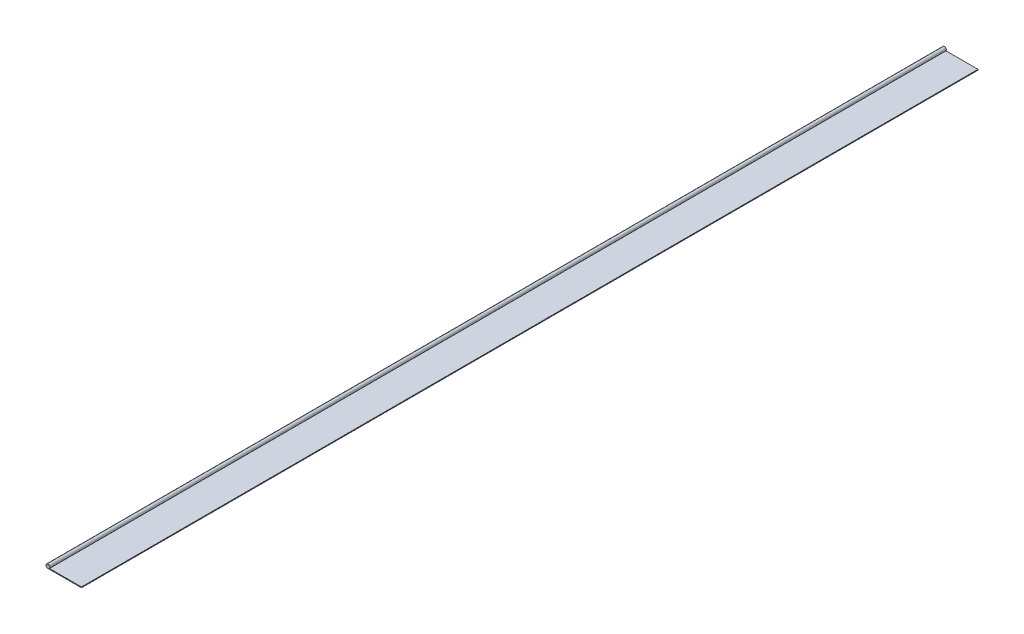
ISO-10303-21;
HEADER;
FILE_DESCRIPTION(('STEP AP214'),'2;1');
FILE_NAME('part.step','',(''),(''),'','','');
FILE_SCHEMA(('AUTOMOTIVE_DESIGN { 1 0 10303 214 1 1 1 1 }'));
ENDSEC;
DATA;
#1=APPLICATION_CONTEXT('core data for automotive mechanical design processes');
#2=APPLICATION_PROTOCOL_DEFINITION('international standard','automotive_design',2000,#1);
#3=PRODUCT_CONTEXT('',#1,'mechanical');
#4=PRODUCT('Part','Part','',(#3));
#5=PRODUCT_RELATED_PRODUCT_CATEGORY('part','',(#4));
#6=PRODUCT_DEFINITION_FORMATION('','',#4);
#7=PRODUCT_DEFINITION_CONTEXT('part definition',#1,'design');
#8=PRODUCT_DEFINITION('design','',#6,#7);
#9=PRODUCT_DEFINITION_SHAPE('','',#8);
#10=(LENGTH_UNIT() NAMED_UNIT(*) SI_UNIT(.MILLI.,.METRE.));
#11=(NAMED_UNIT(*) PLANE_ANGLE_UNIT() SI_UNIT($,.RADIAN.));
#12=(NAMED_UNIT(*) SI_UNIT($,.STERADIAN.) SOLID_ANGLE_UNIT());
#13=UNCERTAINTY_MEASURE_WITH_UNIT(LENGTH_MEASURE(1.E-05),#10,'distance_accuracy_value','');
#14=(GEOMETRIC_REPRESENTATION_CONTEXT(3) GLOBAL_UNCERTAINTY_ASSIGNED_CONTEXT((#13)) GLOBAL_UNIT_ASSIGNED_CONTEXT((#10,
#11,#12)) REPRESENTATION_CONTEXT('',''));
#15=CARTESIAN_POINT('',(0.,0.,0.));
#16=DIRECTION('',(0.,0.,1.));
#17=DIRECTION('',(1.,0.,0.));
#18=AXIS2_PLACEMENT_3D('',#15,#16,#17);
#19=CARTESIAN_POINT('',(0.,-0.900000000000003,700.));
#20=DIRECTION('',(0.,-1.,0.));
#21=DIRECTION('',(1.,0.,0.));
#22=AXIS2_PLACEMENT_3D('',#19,#20,#21);
#23=PLANE('',#22);
#24=DIRECTION('',(-1.,0.,0.));
#25=VECTOR('',#24,1.);
#26=CARTESIAN_POINT('',(0.,-0.900000000000003,0.));
#27=LINE('',#26,#25);
#28=CARTESIAN_POINT('',(26.2,-0.9,0.));
#29=VERTEX_POINT('',#28);
#30=CARTESIAN_POINT('',(1.2,-0.900000000000003,0.));
#31=VERTEX_POINT('',#30);
#32=EDGE_CURVE('E98',#29,#31,#27,.T.);
#33=ORIENTED_EDGE('',*,*,#32,.T.);
#34=DIRECTION('',(0.,0.,-1.));
#35=VECTOR('',#34,1.);
#36=CARTESIAN_POINT('',(1.2,-0.900000000000003,700.));
#37=LINE('',#36,#35);
#38=CARTESIAN_POINT('',(1.2,-0.900000000000003,700.));
#39=VERTEX_POINT('',#38);
#40=EDGE_CURVE('E11',#39,#31,#37,.T.);
#41=ORIENTED_EDGE('',*,*,#40,.F.);
#42=DIRECTION('',(-1.,0.,0.));
#43=VECTOR('',#42,1.);
#44=CARTESIAN_POINT('',(0.,-0.900000000000003,700.));
#45=LINE('',#44,#43);
#46=CARTESIAN_POINT('',(26.2,-0.9,700.));
#47=VERTEX_POINT('',#46);
#48=EDGE_CURVE('E86',#47,#39,#45,.T.);
#49=ORIENTED_EDGE('',*,*,#48,.F.);
#50=DIRECTION('',(0.,0.,-1.));
#51=VECTOR('',#50,1.);
#52=CARTESIAN_POINT('',(26.2,-0.9,700.));
#53=LINE('',#52,#51);
#54=EDGE_CURVE('E94',#47,#29,#53,.T.);
#55=ORIENTED_EDGE('',*,*,#54,.T.);
#56=EDGE_LOOP('',(#33,#41,#49,#55));
#57=FACE_BOUND('',#56,.T.);
#58=ADVANCED_FACE('F35',(#57),#23,.F.);
#59=CARTESIAN_POINT('',(0.,0.,700.));
#60=DIRECTION('',(0.,0.,-1.));
#61=DIRECTION('',(-1.,0.,0.));
#62=AXIS2_PLACEMENT_3D('',#59,#60,#61);
#63=CYLINDRICAL_SURFACE('',#62,1.5);
#64=CARTESIAN_POINT('',(0.,0.,0.));
#65=DIRECTION('',(0.,0.,1.));
#66=DIRECTION('',(1.,0.,0.));
#67=AXIS2_PLACEMENT_3D('',#64,#65,#66);
#68=CIRCLE('',#67,1.5);
#69=CARTESIAN_POINT('',(0.,-1.5,0.));
#70=VERTEX_POINT('',#69);
#71=EDGE_CURVE('E90',#31,#70,#68,.T.);
#72=ORIENTED_EDGE('',*,*,#71,.T.);
#73=DIRECTION('',(0.,0.,-1.));
#74=VECTOR('',#73,1.);
#75=CARTESIAN_POINT('',(0.,-1.5,700.));
#76=LINE('',#75,#74);
#77=CARTESIAN_POINT('',(0.,-1.5,700.));
#78=VERTEX_POINT('',#77);
#79=EDGE_CURVE('E43',#78,#70,#76,.T.);
#80=ORIENTED_EDGE('',*,*,#79,.F.);
#81=CARTESIAN_POINT('',(0.,0.,700.));
#82=DIRECTION('',(0.,0.,1.));
#83=DIRECTION('',(1.,0.,0.));
#84=AXIS2_PLACEMENT_3D('',#81,#82,#83);
#85=CIRCLE('',#84,1.5);
#86=EDGE_CURVE('E81',#39,#78,#85,.T.);
#87=ORIENTED_EDGE('',*,*,#86,.F.);
#88=ORIENTED_EDGE('',*,*,#40,.T.);
#89=EDGE_LOOP('',(#72,#80,#87,#88));
#90=FACE_BOUND('',#89,.T.);
#91=ADVANCED_FACE('F89',(#90),#63,.T.);
#92=CARTESIAN_POINT('',(0.,-1.5,700.));
#93=DIRECTION('',(0.,1.,0.));
#94=DIRECTION('',(0.,0.,1.));
#95=AXIS2_PLACEMENT_3D('',#92,#93,#94);
#96=PLANE('',#95);
#97=DIRECTION('',(1.,0.,0.));
#98=VECTOR('',#97,1.);
#99=CARTESIAN_POINT('',(0.,-1.5,0.));
#100=LINE('',#99,#98);
#101=CARTESIAN_POINT('',(26.2,-1.5,0.));
#102=VERTEX_POINT('',#101);
#103=EDGE_CURVE('E68',#70,#102,#100,.T.);
#104=ORIENTED_EDGE('',*,*,#103,.T.);
#105=DIRECTION('',(0.,0.,-1.));
#106=VECTOR('',#105,1.);
#107=CARTESIAN_POINT('',(26.2,-1.5,700.));
#108=LINE('',#107,#106);
#109=CARTESIAN_POINT('',(26.2,-1.5,700.));
#110=VERTEX_POINT('',#109);
#111=EDGE_CURVE('E91',#110,#102,#108,.T.);
#112=ORIENTED_EDGE('',*,*,#111,.F.);
#113=DIRECTION('',(1.,0.,0.));
#114=VECTOR('',#113,1.);
#115=CARTESIAN_POINT('',(0.,-1.5,700.));
#116=LINE('',#115,#114);
#117=EDGE_CURVE('E84',#78,#110,#116,.T.);
#118=ORIENTED_EDGE('',*,*,#117,.F.);
#119=ORIENTED_EDGE('',*,*,#79,.T.);
#120=EDGE_LOOP('',(#104,#112,#118,#119));
#121=FACE_BOUND('',#120,.T.);
#122=ADVANCED_FACE('F92',(#121),#96,.F.);
#123=CARTESIAN_POINT('',(26.2,0.,700.));
#124=DIRECTION('',(-1.,0.,0.));
#125=DIRECTION('',(0.,0.,1.));
#126=AXIS2_PLACEMENT_3D('',#123,#124,#125);
#127=PLANE('',#126);
#128=DIRECTION('',(0.,1.,0.));
#129=VECTOR('',#128,1.);
#130=CARTESIAN_POINT('',(26.2,0.,0.));
#131=LINE('',#130,#129);
#132=EDGE_CURVE('E74',#102,#29,#131,.T.);
#133=ORIENTED_EDGE('',*,*,#132,.T.);
#134=ORIENTED_EDGE('',*,*,#54,.F.);
#135=DIRECTION('',(0.,1.,0.));
#136=VECTOR('',#135,1.);
#137=CARTESIAN_POINT('',(26.2,0.,700.));
#138=LINE('',#137,#136);
#139=EDGE_CURVE('E51',#110,#47,#138,.T.);
#140=ORIENTED_EDGE('',*,*,#139,.F.);
#141=ORIENTED_EDGE('',*,*,#111,.T.);
#142=EDGE_LOOP('',(#133,#134,#140,#141));
#143=FACE_BOUND('',#142,.T.);
#144=ADVANCED_FACE('F105',(#143),#127,.F.);
#145=CARTESIAN_POINT('',(0.,0.,700.));
#146=DIRECTION('',(0.,0.,1.));
#147=DIRECTION('',(1.,0.,0.));
#148=AXIS2_PLACEMENT_3D('',#145,#146,#147);
#149=PLANE('',#148);
#150=ORIENTED_EDGE('',*,*,#48,.T.);
#151=ORIENTED_EDGE('',*,*,#86,.T.);
#152=ORIENTED_EDGE('',*,*,#117,.T.);
#153=ORIENTED_EDGE('',*,*,#139,.T.);
#154=EDGE_LOOP('',(#150,#151,#152,#153));
#155=FACE_BOUND('',#154,.T.);
#156=ADVANCED_FACE('F82',(#155),#149,.T.);
#157=CARTESIAN_POINT('',(0.,0.,0.));
#158=DIRECTION('',(0.,0.,1.));
#159=DIRECTION('',(1.,0.,0.));
#160=AXIS2_PLACEMENT_3D('',#157,#158,#159);
#161=PLANE('',#160);
#162=ORIENTED_EDGE('',*,*,#32,.F.);
#163=ORIENTED_EDGE('',*,*,#132,.F.);
#164=ORIENTED_EDGE('',*,*,#103,.F.);
#165=ORIENTED_EDGE('',*,*,#71,.F.);
#166=EDGE_LOOP('',(#162,#163,#164,#165));
#167=FACE_BOUND('',#166,.T.);
#168=ADVANCED_FACE('F108',(#167),#161,.F.);
#169=CLOSED_SHELL('',(#58,#91,#122,#144,#156,#168));
#170=MANIFOLD_SOLID_BREP('B2',#169);
#171=ADVANCED_BREP_SHAPE_REPRESENTATION('',(#18,#170),#14);
#172=SHAPE_DEFINITION_REPRESENTATION(#9,#171);
ENDSEC;
END-ISO-10303-21;
